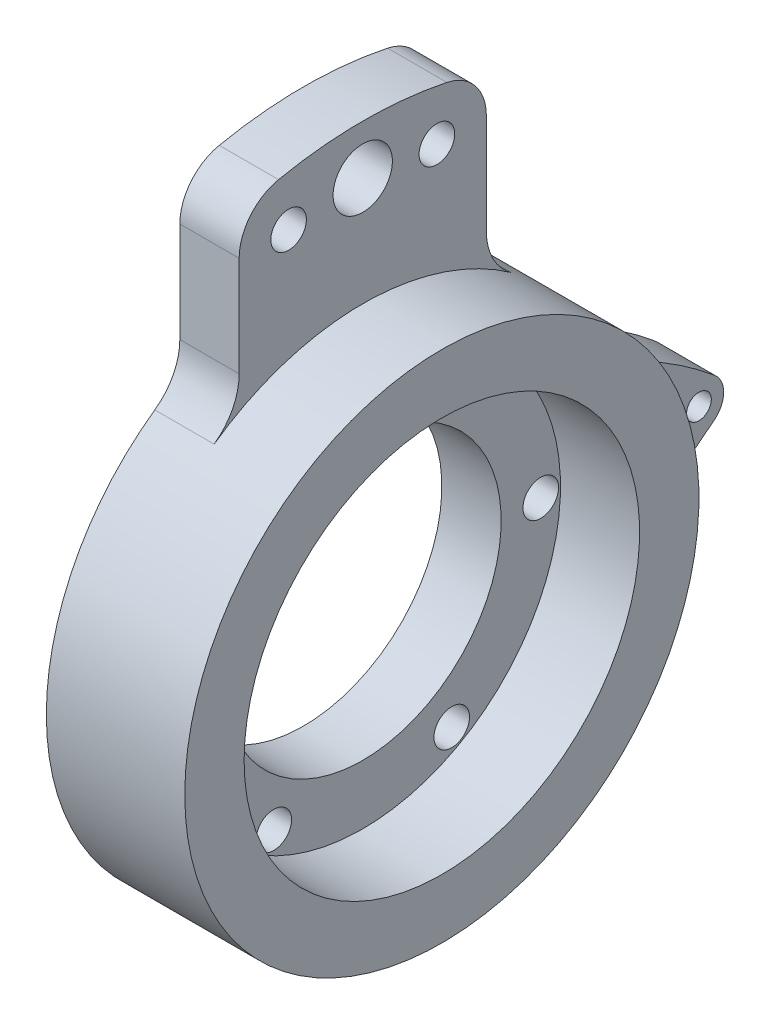
ISO-10303-21;
HEADER;
FILE_DESCRIPTION(('STEP AP214'),'2;1');
FILE_NAME('part.step','',(''),(''),'','','');
FILE_SCHEMA(('AUTOMOTIVE_DESIGN { 1 0 10303 214 1 1 1 1 }'));
ENDSEC;
DATA;
#1=APPLICATION_CONTEXT('core data for automotive mechanical design processes');
#2=APPLICATION_PROTOCOL_DEFINITION('international standard','automotive_design',2000,#1);
#3=PRODUCT_CONTEXT('',#1,'mechanical');
#4=PRODUCT('Part','Part','',(#3));
#5=PRODUCT_RELATED_PRODUCT_CATEGORY('part','',(#4));
#6=PRODUCT_DEFINITION_FORMATION('','',#4);
#7=PRODUCT_DEFINITION_CONTEXT('part definition',#1,'design');
#8=PRODUCT_DEFINITION('design','',#6,#7);
#9=PRODUCT_DEFINITION_SHAPE('','',#8);
#10=(LENGTH_UNIT() NAMED_UNIT(*) SI_UNIT(.MILLI.,.METRE.));
#11=(NAMED_UNIT(*) PLANE_ANGLE_UNIT() SI_UNIT($,.RADIAN.));
#12=(NAMED_UNIT(*) SI_UNIT($,.STERADIAN.) SOLID_ANGLE_UNIT());
#13=UNCERTAINTY_MEASURE_WITH_UNIT(LENGTH_MEASURE(1.E-05),#10,'distance_accuracy_value','');
#14=(GEOMETRIC_REPRESENTATION_CONTEXT(3) GLOBAL_UNCERTAINTY_ASSIGNED_CONTEXT((#13)) GLOBAL_UNIT_ASSIGNED_CONTEXT((#10,
#11,#12)) REPRESENTATION_CONTEXT('',''));
#15=CARTESIAN_POINT('',(0.,0.,0.));
#16=DIRECTION('',(0.,0.,1.));
#17=DIRECTION('',(1.,0.,0.));
#18=AXIS2_PLACEMENT_3D('',#15,#16,#17);
#19=CARTESIAN_POINT('',(0.,26.,0.));
#20=DIRECTION('',(1.,0.,0.));
#21=DIRECTION('',(0.,0.,-1.));
#22=AXIS2_PLACEMENT_3D('',#19,#20,#21);
#23=PLANE('',#22);
#24=CARTESIAN_POINT('',(0.,0.,-34.));
#25=DIRECTION('',(-1.,0.,0.));
#26=DIRECTION('',(0.,0.,1.));
#27=AXIS2_PLACEMENT_3D('',#24,#25,#26);
#28=CIRCLE('',#27,1.25);
#29=CARTESIAN_POINT('',(0.,0.,-32.75));
#30=VERTEX_POINT('',#29);
#31=EDGE_CURVE('E161',#30,#30,#28,.T.);
#32=ORIENTED_EDGE('',*,*,#31,.F.);
#33=EDGE_LOOP('',(#32));
#34=FACE_BOUND('',#33,.T.);
#35=CARTESIAN_POINT('',(0.,0.,0.));
#36=DIRECTION('',(-1.,0.,0.));
#37=DIRECTION('',(0.,0.,1.));
#38=AXIS2_PLACEMENT_3D('',#35,#36,#37);
#39=CIRCLE('',#38,14.);
#40=CARTESIAN_POINT('',(0.,0.,14.));
#41=VERTEX_POINT('',#40);
#42=EDGE_CURVE('E230',#41,#41,#39,.T.);
#43=ORIENTED_EDGE('',*,*,#42,.F.);
#44=EDGE_LOOP('',(#43));
#45=FACE_BOUND('',#44,.T.);
#46=CARTESIAN_POINT('',(0.,0.,0.));
#47=DIRECTION('',(-1.,0.,0.));
#48=DIRECTION('',(0.,0.,1.));
#49=AXIS2_PLACEMENT_3D('',#46,#47,#48);
#50=CIRCLE('',#49,26.);
#51=CARTESIAN_POINT('',(0.,-10.,-24.));
#52=VERTEX_POINT('',#51);
#53=CARTESIAN_POINT('',(0.,21.2146535073637,15.03125));
#54=VERTEX_POINT('',#53);
#55=EDGE_CURVE('E216',#52,#54,#50,.T.);
#56=ORIENTED_EDGE('',*,*,#55,.T.);
#57=CARTESIAN_POINT('',(0.,26.1103427782938,18.5));
#58=DIRECTION('',(1.,0.,0.));
#59=DIRECTION('',(0.,0.,-1.));
#60=AXIS2_PLACEMENT_3D('',#57,#58,#59);
#61=CIRCLE('',#60,6.);
#62=CARTESIAN_POINT('',(0.,26.1103427782938,12.5));
#63=VERTEX_POINT('',#62);
#64=EDGE_CURVE('E47',#54,#63,#61,.T.);
#65=ORIENTED_EDGE('',*,*,#64,.T.);
#66=DIRECTION('',(0.,-1.,0.));
#67=VECTOR('',#66,1.);
#68=CARTESIAN_POINT('',(0.,36.2318920289846,12.5));
#69=LINE('',#68,#67);
#70=CARTESIAN_POINT('',(0.,36.2318920289846,12.5));
#71=VERTEX_POINT('',#70);
#72=EDGE_CURVE('E461',#71,#63,#69,.T.);
#73=ORIENTED_EDGE('',*,*,#72,.F.);
#74=CARTESIAN_POINT('',(0.,36.2318920289846,7.5));
#75=DIRECTION('',(1.,0.,0.));
#76=DIRECTION('',(0.,0.,-1.));
#77=AXIS2_PLACEMENT_3D('',#74,#75,#76);
#78=CIRCLE('',#77,5.00000000000001);
#79=CARTESIAN_POINT('',(0.,41.1280936545231,8.51351351351351));
#80=VERTEX_POINT('',#79);
#81=EDGE_CURVE('E160',#80,#71,#78,.T.);
#82=ORIENTED_EDGE('',*,*,#81,.F.);
#83=CARTESIAN_POINT('',(0.,0.,0.));
#84=DIRECTION('',(1.,0.,0.));
#85=DIRECTION('',(0.,0.,-1.));
#86=AXIS2_PLACEMENT_3D('',#83,#84,#85);
#87=CIRCLE('',#86,42.);
#88=CARTESIAN_POINT('',(0.,41.1280936545231,-8.51351351351351));
#89=VERTEX_POINT('',#88);
#90=EDGE_CURVE('E156',#89,#80,#87,.T.);
#91=ORIENTED_EDGE('',*,*,#90,.F.);
#92=CARTESIAN_POINT('',(0.,36.2318920289846,-7.5));
#93=DIRECTION('',(1.,0.,0.));
#94=DIRECTION('',(0.,0.,-1.));
#95=AXIS2_PLACEMENT_3D('',#92,#93,#94);
#96=CIRCLE('',#95,5.00000000000001);
#97=CARTESIAN_POINT('',(0.,36.2318920289846,-12.5));
#98=VERTEX_POINT('',#97);
#99=EDGE_CURVE('E464',#98,#89,#96,.T.);
#100=ORIENTED_EDGE('',*,*,#99,.F.);
#101=DIRECTION('',(0.,1.,0.));
#102=VECTOR('',#101,1.);
#103=CARTESIAN_POINT('',(0.,36.2318920289846,-12.5));
#104=LINE('',#103,#102);
#105=CARTESIAN_POINT('',(0.,26.1103427782938,-12.5));
#106=VERTEX_POINT('',#105);
#107=EDGE_CURVE('E264',#106,#98,#104,.T.);
#108=ORIENTED_EDGE('',*,*,#107,.F.);
#109=CARTESIAN_POINT('',(0.,26.1103427782938,-18.5));
#110=DIRECTION('',(1.,0.,0.));
#111=DIRECTION('',(0.,0.,-1.));
#112=AXIS2_PLACEMENT_3D('',#109,#110,#111);
#113=CIRCLE('',#112,6.);
#114=CARTESIAN_POINT('',(0.,21.2146535073637,-15.03125));
#115=VERTEX_POINT('',#114);
#116=EDGE_CURVE('E243',#106,#115,#113,.T.);
#117=ORIENTED_EDGE('',*,*,#116,.T.);
#118=CARTESIAN_POINT('',(0.,10.,-24.));
#119=VERTEX_POINT('',#118);
#120=EDGE_CURVE('E215',#115,#119,#50,.T.);
#121=ORIENTED_EDGE('',*,*,#120,.T.);
#122=CARTESIAN_POINT('',(0.,11.5384615384615,-27.6923076923077));
#123=DIRECTION('',(-1.,0.,0.));
#124=DIRECTION('',(0.,0.,1.));
#125=AXIS2_PLACEMENT_3D('',#122,#123,#124);
#126=CIRCLE('',#125,4.);
#127=CARTESIAN_POINT('',(0.,7.88278972648782,-26.0687118056595));
#128=VERTEX_POINT('',#127);
#129=EDGE_CURVE('E179',#128,#119,#126,.T.);
#130=ORIENTED_EDGE('',*,*,#129,.F.);
#131=CARTESIAN_POINT('',(0.,-28.6739283932494,-9.83275293917803));
#132=DIRECTION('',(1.,0.,0.));
#133=DIRECTION('',(0.,0.,-1.));
#134=AXIS2_PLACEMENT_3D('',#131,#132,#133);
#135=CIRCLE('',#134,40.);
#136=CARTESIAN_POINT('',(0.,1.91159522621663,-35.6111498040548));
#137=VERTEX_POINT('',#136);
#138=EDGE_CURVE('E195',#137,#128,#135,.T.);
#139=ORIENTED_EDGE('',*,*,#138,.F.);
#140=CARTESIAN_POINT('',(0.,0.,-34.));
#141=DIRECTION('',(1.,0.,0.));
#142=DIRECTION('',(0.,0.,-1.));
#143=AXIS2_PLACEMENT_3D('',#140,#141,#142);
#144=CIRCLE('',#143,2.50000000000001);
#145=CARTESIAN_POINT('',(0.,-1.91159522621663,-35.6111498040548));
#146=VERTEX_POINT('',#145);
#147=EDGE_CURVE('E193',#146,#137,#144,.T.);
#148=ORIENTED_EDGE('',*,*,#147,.F.);
#149=CARTESIAN_POINT('',(0.,28.6739283932494,-9.83275293917803));
#150=DIRECTION('',(1.,0.,0.));
#151=DIRECTION('',(0.,0.,-1.));
#152=AXIS2_PLACEMENT_3D('',#149,#150,#151);
#153=CIRCLE('',#152,40.);
#154=CARTESIAN_POINT('',(0.,-7.88278972648782,-26.0687118056595));
#155=VERTEX_POINT('',#154);
#156=EDGE_CURVE('E191',#155,#146,#153,.T.);
#157=ORIENTED_EDGE('',*,*,#156,.F.);
#158=CARTESIAN_POINT('',(0.,-11.5384615384615,-27.6923076923077));
#159=DIRECTION('',(-1.,0.,0.));
#160=DIRECTION('',(0.,0.,1.));
#161=AXIS2_PLACEMENT_3D('',#158,#159,#160);
#162=CIRCLE('',#161,4.);
#163=EDGE_CURVE('E174',#52,#155,#162,.T.);
#164=ORIENTED_EDGE('',*,*,#163,.F.);
#165=EDGE_LOOP('',(#56,#65,#73,#82,#91,#100,#108,#117,#121,#130,#139,#148,#157,#164));
#166=FACE_BOUND('',#165,.T.);
#167=CARTESIAN_POINT('',(0.,37.,0.));
#168=DIRECTION('',(1.,0.,0.));
#169=DIRECTION('',(0.,0.,-1.));
#170=AXIS2_PLACEMENT_3D('',#167,#168,#169);
#171=CIRCLE('',#170,3.);
#172=CARTESIAN_POINT('',(0.,37.,-3.));
#173=VERTEX_POINT('',#172);
#174=EDGE_CURVE('E450',#173,#173,#171,.T.);
#175=ORIENTED_EDGE('',*,*,#174,.T.);
#176=EDGE_LOOP('',(#175));
#177=FACE_BOUND('',#176,.T.);
#178=CARTESIAN_POINT('',(0.,0.,18.));
#179=DIRECTION('',(-1.,0.,0.));
#180=DIRECTION('',(0.,0.,1.));
#181=AXIS2_PLACEMENT_3D('',#178,#179,#180);
#182=CIRCLE('',#181,1.8);
#183=CARTESIAN_POINT('',(0.,0.,19.8));
#184=VERTEX_POINT('',#183);
#185=EDGE_CURVE('E444',#184,#184,#182,.T.);
#186=ORIENTED_EDGE('',*,*,#185,.F.);
#187=EDGE_LOOP('',(#186));
#188=FACE_BOUND('',#187,.T.);
#189=CARTESIAN_POINT('',(0.,15.5884572681199,8.99999999999996));
#190=DIRECTION('',(-1.,0.,0.));
#191=DIRECTION('',(0.,0.,1.));
#192=AXIS2_PLACEMENT_3D('',#189,#190,#191);
#193=CIRCLE('',#192,1.8);
#194=CARTESIAN_POINT('',(0.,15.5884572681199,10.8));
#195=VERTEX_POINT('',#194);
#196=EDGE_CURVE('E438',#195,#195,#193,.T.);
#197=ORIENTED_EDGE('',*,*,#196,.F.);
#198=EDGE_LOOP('',(#197));
#199=FACE_BOUND('',#198,.T.);
#200=CARTESIAN_POINT('',(0.,15.5884572681199,-9.00000000000007));
#201=DIRECTION('',(-1.,0.,0.));
#202=DIRECTION('',(0.,0.,1.));
#203=AXIS2_PLACEMENT_3D('',#200,#201,#202);
#204=CIRCLE('',#203,1.8);
#205=CARTESIAN_POINT('',(0.,15.5884572681199,-7.20000000000007));
#206=VERTEX_POINT('',#205);
#207=EDGE_CURVE('E432',#206,#206,#204,.T.);
#208=ORIENTED_EDGE('',*,*,#207,.F.);
#209=EDGE_LOOP('',(#208));
#210=FACE_BOUND('',#209,.T.);
#211=CARTESIAN_POINT('',(0.,0.,-18.));
#212=DIRECTION('',(-1.,0.,0.));
#213=DIRECTION('',(0.,0.,1.));
#214=AXIS2_PLACEMENT_3D('',#211,#212,#213);
#215=CIRCLE('',#214,1.8);
#216=CARTESIAN_POINT('',(0.,0.,-16.2));
#217=VERTEX_POINT('',#216);
#218=EDGE_CURVE('E426',#217,#217,#215,.T.);
#219=ORIENTED_EDGE('',*,*,#218,.F.);
#220=EDGE_LOOP('',(#219));
#221=FACE_BOUND('',#220,.T.);
#222=CARTESIAN_POINT('',(0.,-15.58845726812,-8.99999999999985));
#223=DIRECTION('',(-1.,0.,0.));
#224=DIRECTION('',(0.,0.,1.));
#225=AXIS2_PLACEMENT_3D('',#222,#223,#224);
#226=CIRCLE('',#225,1.8);
#227=CARTESIAN_POINT('',(0.,-15.58845726812,-7.19999999999985));
#228=VERTEX_POINT('',#227);
#229=EDGE_CURVE('E420',#228,#228,#226,.T.);
#230=ORIENTED_EDGE('',*,*,#229,.F.);
#231=EDGE_LOOP('',(#230));
#232=FACE_BOUND('',#231,.T.);
#233=CARTESIAN_POINT('',(0.,-15.5884572681198,9.00000000000018));
#234=DIRECTION('',(-1.,0.,0.));
#235=DIRECTION('',(0.,0.,1.));
#236=AXIS2_PLACEMENT_3D('',#233,#234,#235);
#237=CIRCLE('',#236,1.8);
#238=CARTESIAN_POINT('',(0.,-15.5884572681198,10.8000000000002));
#239=VERTEX_POINT('',#238);
#240=EDGE_CURVE('E414',#239,#239,#237,.T.);
#241=ORIENTED_EDGE('',*,*,#240,.F.);
#242=EDGE_LOOP('',(#241));
#243=FACE_BOUND('',#242,.T.);
#244=CARTESIAN_POINT('',(0.,36.2318920289846,-7.5));
#245=DIRECTION('',(-1.,0.,0.));
#246=DIRECTION('',(0.,0.,1.));
#247=AXIS2_PLACEMENT_3D('',#244,#245,#246);
#248=CIRCLE('',#247,1.8);
#249=CARTESIAN_POINT('',(0.,36.2318920289846,-5.7));
#250=VERTEX_POINT('',#249);
#251=EDGE_CURVE('E405',#250,#250,#248,.T.);
#252=ORIENTED_EDGE('',*,*,#251,.F.);
#253=EDGE_LOOP('',(#252));
#254=FACE_BOUND('',#253,.T.);
#255=CARTESIAN_POINT('',(0.,36.2318920289846,7.5));
#256=DIRECTION('',(-1.,0.,0.));
#257=DIRECTION('',(0.,0.,1.));
#258=AXIS2_PLACEMENT_3D('',#255,#256,#257);
#259=CIRCLE('',#258,1.8);
#260=CARTESIAN_POINT('',(0.,36.2318920289846,9.3));
#261=VERTEX_POINT('',#260);
#262=EDGE_CURVE('E401',#261,#261,#259,.T.);
#263=ORIENTED_EDGE('',*,*,#262,.F.);
#264=EDGE_LOOP('',(#263));
#265=FACE_BOUND('',#264,.T.);
#266=ADVANCED_FACE('F39',(#34,#45,#166,#177,#188,#199,#210,#221,#232,#243,#254,#265),#23,.F.);
#267=CARTESIAN_POINT('',(-2.25720811826591,0.,0.));
#268=DIRECTION('',(-1.,0.,0.));
#269=DIRECTION('',(0.,0.,1.));
#270=AXIS2_PLACEMENT_3D('',#267,#268,#269);
#271=CYLINDRICAL_SURFACE('',#270,26.);
#272=CARTESIAN_POINT('',(14.0000000000001,0.,0.));
#273=DIRECTION('',(-1.,0.,0.));
#274=DIRECTION('',(0.,0.,1.));
#275=AXIS2_PLACEMENT_3D('',#272,#273,#274);
#276=CIRCLE('',#275,26.);
#277=CARTESIAN_POINT('',(14.0000000000001,0.,26.));
#278=VERTEX_POINT('',#277);
#279=EDGE_CURVE('E218',#278,#278,#276,.T.);
#280=ORIENTED_EDGE('',*,*,#279,.T.);
#281=EDGE_LOOP('',(#280));
#282=FACE_BOUND('',#281,.T.);
#283=ORIENTED_EDGE('',*,*,#120,.F.);
#284=DIRECTION('',(-1.,0.,0.));
#285=VECTOR('',#284,1.);
#286=CARTESIAN_POINT('',(-2.25720811826591,21.2146535073637,-15.03125));
#287=LINE('',#286,#285);
#288=CARTESIAN_POINT('',(6.00000000000001,21.2146535073637,-15.03125));
#289=VERTEX_POINT('',#288);
#290=EDGE_CURVE('E239',#115,#289,#287,.F.);
#291=ORIENTED_EDGE('',*,*,#290,.T.);
#292=CARTESIAN_POINT('',(6.00000000000001,0.,0.));
#293=DIRECTION('',(-1.,0.,0.));
#294=DIRECTION('',(0.,0.,-1.));
#295=AXIS2_PLACEMENT_3D('',#292,#293,#294);
#296=CIRCLE('',#295,26.);
#297=CARTESIAN_POINT('',(6.00000000000001,21.2146535073637,15.03125));
#298=VERTEX_POINT('',#297);
#299=EDGE_CURVE('E145',#298,#289,#296,.T.);
#300=ORIENTED_EDGE('',*,*,#299,.F.);
#301=DIRECTION('',(-1.,0.,0.));
#302=VECTOR('',#301,1.);
#303=CARTESIAN_POINT('',(-2.25720811826591,21.2146535073637,15.03125));
#304=LINE('',#303,#302);
#305=EDGE_CURVE('E236',#298,#54,#304,.T.);
#306=ORIENTED_EDGE('',*,*,#305,.T.);
#307=ORIENTED_EDGE('',*,*,#55,.F.);
#308=DIRECTION('',(-1.,0.,0.));
#309=VECTOR('',#308,1.);
#310=CARTESIAN_POINT('',(6.00000000000001,-10.,-24.));
#311=LINE('',#310,#309);
#312=CARTESIAN_POINT('',(6.00000000000001,-10.,-24.));
#313=VERTEX_POINT('',#312);
#314=EDGE_CURVE('E213',#313,#52,#311,.T.);
#315=ORIENTED_EDGE('',*,*,#314,.F.);
#316=CARTESIAN_POINT('',(6.00000000000001,0.,0.));
#317=DIRECTION('',(-1.,0.,0.));
#318=DIRECTION('',(0.,0.,1.));
#319=AXIS2_PLACEMENT_3D('',#316,#317,#318);
#320=CIRCLE('',#319,26.);
#321=CARTESIAN_POINT('',(6.00000000000001,10.,-24.));
#322=VERTEX_POINT('',#321);
#323=EDGE_CURVE('E175',#322,#313,#320,.T.);
#324=ORIENTED_EDGE('',*,*,#323,.F.);
#325=DIRECTION('',(-1.,0.,0.));
#326=VECTOR('',#325,1.);
#327=CARTESIAN_POINT('',(6.00000000000001,10.,-24.));
#328=LINE('',#327,#326);
#329=EDGE_CURVE('E189',#322,#119,#328,.T.);
#330=ORIENTED_EDGE('',*,*,#329,.T.);
#331=EDGE_LOOP('',(#283,#291,#300,#306,#307,#315,#324,#330));
#332=FACE_BOUND('',#331,.T.);
#333=ADVANCED_FACE('F266',(#282,#332),#271,.T.);
#334=CARTESIAN_POINT('',(-2.25720811826591,0.,0.));
#335=DIRECTION('',(-1.,0.,0.));
#336=DIRECTION('',(0.,0.,1.));
#337=AXIS2_PLACEMENT_3D('',#334,#335,#336);
#338=CYLINDRICAL_SURFACE('',#337,14.);
#339=CARTESIAN_POINT('',(6.00000000000001,0.,0.));
#340=DIRECTION('',(-1.,0.,0.));
#341=DIRECTION('',(0.,0.,1.));
#342=AXIS2_PLACEMENT_3D('',#339,#340,#341);
#343=CIRCLE('',#342,14.);
#344=CARTESIAN_POINT('',(6.00000000000001,0.,14.));
#345=VERTEX_POINT('',#344);
#346=EDGE_CURVE('E227',#345,#345,#343,.T.);
#347=ORIENTED_EDGE('',*,*,#346,.F.);
#348=EDGE_LOOP('',(#347));
#349=FACE_BOUND('',#348,.T.);
#350=ORIENTED_EDGE('',*,*,#42,.T.);
#351=EDGE_LOOP('',(#350));
#352=FACE_BOUND('',#351,.T.);
#353=ADVANCED_FACE('F310',(#349,#352),#338,.F.);
#354=CARTESIAN_POINT('',(6.00000000000001,14.,0.));
#355=DIRECTION('',(-1.,0.,0.));
#356=DIRECTION('',(0.,0.,1.));
#357=AXIS2_PLACEMENT_3D('',#354,#355,#356);
#358=PLANE('',#357);
#359=CARTESIAN_POINT('',(6.00000000000001,-15.5884572681198,9.00000000000018));
#360=DIRECTION('',(-1.,0.,0.));
#361=DIRECTION('',(0.,0.,1.));
#362=AXIS2_PLACEMENT_3D('',#359,#360,#361);
#363=CIRCLE('',#362,1.8);
#364=CARTESIAN_POINT('',(6.00000000000001,-15.5884572681198,10.8000000000002));
#365=VERTEX_POINT('',#364);
#366=EDGE_CURVE('E417',#365,#365,#363,.T.);
#367=ORIENTED_EDGE('',*,*,#366,.T.);
#368=EDGE_LOOP('',(#367));
#369=FACE_BOUND('',#368,.T.);
#370=CARTESIAN_POINT('',(6.00000000000001,-15.58845726812,-8.99999999999985));
#371=DIRECTION('',(-1.,0.,0.));
#372=DIRECTION('',(0.,0.,1.));
#373=AXIS2_PLACEMENT_3D('',#370,#371,#372);
#374=CIRCLE('',#373,1.8);
#375=CARTESIAN_POINT('',(6.00000000000001,-15.58845726812,-7.19999999999985));
#376=VERTEX_POINT('',#375);
#377=EDGE_CURVE('E423',#376,#376,#374,.T.);
#378=ORIENTED_EDGE('',*,*,#377,.T.);
#379=EDGE_LOOP('',(#378));
#380=FACE_BOUND('',#379,.T.);
#381=CARTESIAN_POINT('',(6.00000000000001,0.,-18.));
#382=DIRECTION('',(-1.,0.,0.));
#383=DIRECTION('',(0.,0.,1.));
#384=AXIS2_PLACEMENT_3D('',#381,#382,#383);
#385=CIRCLE('',#384,1.8);
#386=CARTESIAN_POINT('',(6.00000000000001,0.,-16.2));
#387=VERTEX_POINT('',#386);
#388=EDGE_CURVE('E429',#387,#387,#385,.T.);
#389=ORIENTED_EDGE('',*,*,#388,.T.);
#390=EDGE_LOOP('',(#389));
#391=FACE_BOUND('',#390,.T.);
#392=CARTESIAN_POINT('',(6.00000000000001,15.5884572681199,-9.00000000000007));
#393=DIRECTION('',(-1.,0.,0.));
#394=DIRECTION('',(0.,0.,1.));
#395=AXIS2_PLACEMENT_3D('',#392,#393,#394);
#396=CIRCLE('',#395,1.8);
#397=CARTESIAN_POINT('',(6.00000000000001,15.5884572681199,-7.20000000000007));
#398=VERTEX_POINT('',#397);
#399=EDGE_CURVE('E435',#398,#398,#396,.T.);
#400=ORIENTED_EDGE('',*,*,#399,.T.);
#401=EDGE_LOOP('',(#400));
#402=FACE_BOUND('',#401,.T.);
#403=CARTESIAN_POINT('',(6.00000000000001,15.5884572681199,8.99999999999996));
#404=DIRECTION('',(-1.,0.,0.));
#405=DIRECTION('',(0.,0.,1.));
#406=AXIS2_PLACEMENT_3D('',#403,#404,#405);
#407=CIRCLE('',#406,1.8);
#408=CARTESIAN_POINT('',(6.00000000000001,15.5884572681199,10.8));
#409=VERTEX_POINT('',#408);
#410=EDGE_CURVE('E441',#409,#409,#407,.T.);
#411=ORIENTED_EDGE('',*,*,#410,.T.);
#412=EDGE_LOOP('',(#411));
#413=FACE_BOUND('',#412,.T.);
#414=CARTESIAN_POINT('',(6.00000000000001,0.,18.));
#415=DIRECTION('',(-1.,0.,0.));
#416=DIRECTION('',(0.,0.,1.));
#417=AXIS2_PLACEMENT_3D('',#414,#415,#416);
#418=CIRCLE('',#417,1.8);
#419=CARTESIAN_POINT('',(6.00000000000001,0.,19.8));
#420=VERTEX_POINT('',#419);
#421=EDGE_CURVE('E447',#420,#420,#418,.T.);
#422=ORIENTED_EDGE('',*,*,#421,.T.);
#423=EDGE_LOOP('',(#422));
#424=FACE_BOUND('',#423,.T.);
#425=CARTESIAN_POINT('',(6.00000000000001,0.,0.));
#426=DIRECTION('',(-1.,0.,0.));
#427=DIRECTION('',(0.,0.,1.));
#428=AXIS2_PLACEMENT_3D('',#425,#426,#427);
#429=CIRCLE('',#428,20.);
#430=CARTESIAN_POINT('',(6.00000000000001,0.,20.));
#431=VERTEX_POINT('',#430);
#432=EDGE_CURVE('E224',#431,#431,#429,.T.);
#433=ORIENTED_EDGE('',*,*,#432,.F.);
#434=EDGE_LOOP('',(#433));
#435=FACE_BOUND('',#434,.T.);
#436=ORIENTED_EDGE('',*,*,#346,.T.);
#437=EDGE_LOOP('',(#436));
#438=FACE_BOUND('',#437,.T.);
#439=ADVANCED_FACE('F318',(#369,#380,#391,#402,#413,#424,#435,#438),#358,.F.);
#440=CARTESIAN_POINT('',(-2.25720811826591,0.,0.));
#441=DIRECTION('',(-1.,0.,0.));
#442=DIRECTION('',(0.,0.,1.));
#443=AXIS2_PLACEMENT_3D('',#440,#441,#442);
#444=CYLINDRICAL_SURFACE('',#443,20.);
#445=CARTESIAN_POINT('',(14.0000000000001,0.,0.));
#446=DIRECTION('',(-1.,0.,0.));
#447=DIRECTION('',(0.,0.,1.));
#448=AXIS2_PLACEMENT_3D('',#445,#446,#447);
#449=CIRCLE('',#448,20.);
#450=CARTESIAN_POINT('',(14.0000000000001,0.,20.));
#451=VERTEX_POINT('',#450);
#452=EDGE_CURVE('E221',#451,#451,#449,.T.);
#453=ORIENTED_EDGE('',*,*,#452,.F.);
#454=EDGE_LOOP('',(#453));
#455=FACE_BOUND('',#454,.T.);
#456=ORIENTED_EDGE('',*,*,#432,.T.);
#457=EDGE_LOOP('',(#456));
#458=FACE_BOUND('',#457,.T.);
#459=ADVANCED_FACE('F322',(#455,#458),#444,.F.);
#460=CARTESIAN_POINT('',(14.0000000000001,20.,0.));
#461=DIRECTION('',(-1.,0.,0.));
#462=DIRECTION('',(0.,0.,1.));
#463=AXIS2_PLACEMENT_3D('',#460,#461,#462);
#464=PLANE('',#463);
#465=ORIENTED_EDGE('',*,*,#279,.F.);
#466=EDGE_LOOP('',(#465));
#467=FACE_BOUND('',#466,.T.);
#468=ORIENTED_EDGE('',*,*,#452,.T.);
#469=EDGE_LOOP('',(#468));
#470=FACE_BOUND('',#469,.T.);
#471=ADVANCED_FACE('F326',(#467,#470),#464,.F.);
#472=CARTESIAN_POINT('',(6.00000000000001,-11.5384615384615,-27.6923076923077));
#473=DIRECTION('',(-1.,0.,0.));
#474=DIRECTION('',(0.,0.,1.));
#475=AXIS2_PLACEMENT_3D('',#472,#473,#474);
#476=CYLINDRICAL_SURFACE('',#475,4.);
#477=ORIENTED_EDGE('',*,*,#163,.T.);
#478=DIRECTION('',(-1.,0.,0.));
#479=VECTOR('',#478,1.);
#480=CARTESIAN_POINT('',(6.00000000000001,-7.88278972648782,-26.0687118056595));
#481=LINE('',#480,#479);
#482=CARTESIAN_POINT('',(6.00000000000001,-7.88278972648782,-26.0687118056595));
#483=VERTEX_POINT('',#482);
#484=EDGE_CURVE('E210',#483,#155,#481,.T.);
#485=ORIENTED_EDGE('',*,*,#484,.F.);
#486=CARTESIAN_POINT('',(6.00000000000001,-11.5384615384615,-27.6923076923077));
#487=DIRECTION('',(-1.,0.,0.));
#488=DIRECTION('',(0.,0.,1.));
#489=AXIS2_PLACEMENT_3D('',#486,#487,#488);
#490=CIRCLE('',#489,4.);
#491=EDGE_CURVE('E178',#313,#483,#490,.T.);
#492=ORIENTED_EDGE('',*,*,#491,.F.);
#493=ORIENTED_EDGE('',*,*,#314,.T.);
#494=EDGE_LOOP('',(#477,#485,#492,#493));
#495=FACE_BOUND('',#494,.T.);
#496=ADVANCED_FACE('F329',(#495),#476,.F.);
#497=CARTESIAN_POINT('',(6.00000000000001,28.6739283932494,-9.83275293917803));
#498=DIRECTION('',(-1.,0.,0.));
#499=DIRECTION('',(0.,0.,1.));
#500=AXIS2_PLACEMENT_3D('',#497,#498,#499);
#501=CYLINDRICAL_SURFACE('',#500,40.);
#502=ORIENTED_EDGE('',*,*,#156,.T.);
#503=DIRECTION('',(-1.,0.,0.));
#504=VECTOR('',#503,1.);
#505=CARTESIAN_POINT('',(6.00000000000001,-1.91159522621663,-35.6111498040548));
#506=LINE('',#505,#504);
#507=CARTESIAN_POINT('',(6.00000000000001,-1.91159522621663,-35.6111498040548));
#508=VERTEX_POINT('',#507);
#509=EDGE_CURVE('E207',#508,#146,#506,.T.);
#510=ORIENTED_EDGE('',*,*,#509,.F.);
#511=CARTESIAN_POINT('',(6.00000000000001,28.6739283932494,-9.83275293917803));
#512=DIRECTION('',(1.,0.,0.));
#513=DIRECTION('',(0.,0.,-1.));
#514=AXIS2_PLACEMENT_3D('',#511,#512,#513);
#515=CIRCLE('',#514,40.);
#516=EDGE_CURVE('E181',#483,#508,#515,.T.);
#517=ORIENTED_EDGE('',*,*,#516,.F.);
#518=ORIENTED_EDGE('',*,*,#484,.T.);
#519=EDGE_LOOP('',(#502,#510,#517,#518));
#520=FACE_BOUND('',#519,.T.);
#521=ADVANCED_FACE('F287',(#520),#501,.T.);
#522=CARTESIAN_POINT('',(6.00000000000001,0.,-34.));
#523=DIRECTION('',(-1.,0.,0.));
#524=DIRECTION('',(0.,0.,1.));
#525=AXIS2_PLACEMENT_3D('',#522,#523,#524);
#526=CYLINDRICAL_SURFACE('',#525,2.50000000000001);
#527=ORIENTED_EDGE('',*,*,#147,.T.);
#528=DIRECTION('',(-1.,0.,0.));
#529=VECTOR('',#528,1.);
#530=CARTESIAN_POINT('',(6.00000000000001,1.91159522621663,-35.6111498040548));
#531=LINE('',#530,#529);
#532=CARTESIAN_POINT('',(6.00000000000001,1.91159522621663,-35.6111498040548));
#533=VERTEX_POINT('',#532);
#534=EDGE_CURVE('E204',#533,#137,#531,.T.);
#535=ORIENTED_EDGE('',*,*,#534,.F.);
#536=CARTESIAN_POINT('',(6.00000000000001,0.,-34.));
#537=DIRECTION('',(1.,0.,0.));
#538=DIRECTION('',(0.,0.,-1.));
#539=AXIS2_PLACEMENT_3D('',#536,#537,#538);
#540=CIRCLE('',#539,2.50000000000001);
#541=EDGE_CURVE('E183',#508,#533,#540,.T.);
#542=ORIENTED_EDGE('',*,*,#541,.F.);
#543=ORIENTED_EDGE('',*,*,#509,.T.);
#544=EDGE_LOOP('',(#527,#535,#542,#543));
#545=FACE_BOUND('',#544,.T.);
#546=ADVANCED_FACE('F283',(#545),#526,.T.);
#547=CARTESIAN_POINT('',(6.00000000000001,-28.6739283932494,-9.83275293917803));
#548=DIRECTION('',(-1.,0.,0.));
#549=DIRECTION('',(0.,0.,1.));
#550=AXIS2_PLACEMENT_3D('',#547,#548,#549);
#551=CYLINDRICAL_SURFACE('',#550,40.);
#552=ORIENTED_EDGE('',*,*,#138,.T.);
#553=DIRECTION('',(-1.,0.,0.));
#554=VECTOR('',#553,1.);
#555=CARTESIAN_POINT('',(6.00000000000001,7.88278972648782,-26.0687118056595));
#556=LINE('',#555,#554);
#557=CARTESIAN_POINT('',(6.00000000000001,7.88278972648782,-26.0687118056595));
#558=VERTEX_POINT('',#557);
#559=EDGE_CURVE('E201',#558,#128,#556,.T.);
#560=ORIENTED_EDGE('',*,*,#559,.F.);
#561=CARTESIAN_POINT('',(6.00000000000001,-28.6739283932494,-9.83275293917803));
#562=DIRECTION('',(1.,0.,0.));
#563=DIRECTION('',(0.,0.,-1.));
#564=AXIS2_PLACEMENT_3D('',#561,#562,#563);
#565=CIRCLE('',#564,40.);
#566=EDGE_CURVE('E185',#533,#558,#565,.T.);
#567=ORIENTED_EDGE('',*,*,#566,.F.);
#568=ORIENTED_EDGE('',*,*,#534,.T.);
#569=EDGE_LOOP('',(#552,#560,#567,#568));
#570=FACE_BOUND('',#569,.T.);
#571=ADVANCED_FACE('F278',(#570),#551,.T.);
#572=CARTESIAN_POINT('',(6.00000000000001,11.5384615384615,-27.6923076923077));
#573=DIRECTION('',(-1.,0.,0.));
#574=DIRECTION('',(0.,0.,1.));
#575=AXIS2_PLACEMENT_3D('',#572,#573,#574);
#576=CYLINDRICAL_SURFACE('',#575,4.);
#577=ORIENTED_EDGE('',*,*,#129,.T.);
#578=ORIENTED_EDGE('',*,*,#329,.F.);
#579=CARTESIAN_POINT('',(6.00000000000001,11.5384615384615,-27.6923076923077));
#580=DIRECTION('',(-1.,0.,0.));
#581=DIRECTION('',(0.,0.,1.));
#582=AXIS2_PLACEMENT_3D('',#579,#580,#581);
#583=CIRCLE('',#582,4.);
#584=EDGE_CURVE('E187',#558,#322,#583,.T.);
#585=ORIENTED_EDGE('',*,*,#584,.F.);
#586=ORIENTED_EDGE('',*,*,#559,.T.);
#587=EDGE_LOOP('',(#577,#578,#585,#586));
#588=FACE_BOUND('',#587,.T.);
#589=ADVANCED_FACE('F272',(#588),#576,.F.);
#590=CARTESIAN_POINT('',(6.00000000000001,-5.76923076923077,-13.8461538461538));
#591=DIRECTION('',(-1.,0.,0.));
#592=DIRECTION('',(0.,0.,1.));
#593=AXIS2_PLACEMENT_3D('',#590,#591,#592);
#594=PLANE('',#593);
#595=CARTESIAN_POINT('',(6.00000000000001,0.,-34.));
#596=DIRECTION('',(-1.,0.,0.));
#597=DIRECTION('',(0.,0.,1.));
#598=AXIS2_PLACEMENT_3D('',#595,#596,#597);
#599=CIRCLE('',#598,1.25);
#600=CARTESIAN_POINT('',(6.00000000000001,0.,-32.75));
#601=VERTEX_POINT('',#600);
#602=EDGE_CURVE('E165',#601,#601,#599,.T.);
#603=ORIENTED_EDGE('',*,*,#602,.T.);
#604=EDGE_LOOP('',(#603));
#605=FACE_BOUND('',#604,.T.);
#606=ORIENTED_EDGE('',*,*,#323,.T.);
#607=ORIENTED_EDGE('',*,*,#491,.T.);
#608=ORIENTED_EDGE('',*,*,#516,.T.);
#609=ORIENTED_EDGE('',*,*,#541,.T.);
#610=ORIENTED_EDGE('',*,*,#566,.T.);
#611=ORIENTED_EDGE('',*,*,#584,.T.);
#612=EDGE_LOOP('',(#606,#607,#608,#609,#610,#611));
#613=FACE_BOUND('',#612,.T.);
#614=ADVANCED_FACE('F342',(#605,#613),#594,.F.);
#615=CARTESIAN_POINT('',(0.,0.,-34.));
#616=DIRECTION('',(-1.,0.,0.));
#617=DIRECTION('',(0.,0.,1.));
#618=AXIS2_PLACEMENT_3D('',#615,#616,#617);
#619=CYLINDRICAL_SURFACE('',#618,1.25);
#620=ORIENTED_EDGE('',*,*,#602,.F.);
#621=EDGE_LOOP('',(#620));
#622=FACE_BOUND('',#621,.T.);
#623=ORIENTED_EDGE('',*,*,#31,.T.);
#624=EDGE_LOOP('',(#623));
#625=FACE_BOUND('',#624,.T.);
#626=ADVANCED_FACE('F345',(#622,#625),#619,.F.);
#627=CARTESIAN_POINT('',(6.00000000000001,36.2318920289846,7.5));
#628=DIRECTION('',(1.,0.,0.));
#629=DIRECTION('',(0.,0.,-1.));
#630=AXIS2_PLACEMENT_3D('',#627,#628,#629);
#631=PLANE('',#630);
#632=CARTESIAN_POINT('',(6.00000000000001,36.2318920289846,7.5));
#633=DIRECTION('',(1.,0.,0.));
#634=DIRECTION('',(0.,0.,-1.));
#635=AXIS2_PLACEMENT_3D('',#632,#633,#634);
#636=CIRCLE('',#635,1.8);
#637=CARTESIAN_POINT('',(6.00000000000001,36.2318920289846,5.7));
#638=VERTEX_POINT('',#637);
#639=EDGE_CURVE('E404',#638,#638,#636,.T.);
#640=ORIENTED_EDGE('',*,*,#639,.F.);
#641=EDGE_LOOP('',(#640));
#642=FACE_BOUND('',#641,.T.);
#643=CARTESIAN_POINT('',(6.00000000000001,36.2318920289846,-7.5));
#644=DIRECTION('',(1.,0.,0.));
#645=DIRECTION('',(0.,0.,-1.));
#646=AXIS2_PLACEMENT_3D('',#643,#644,#645);
#647=CIRCLE('',#646,1.8);
#648=CARTESIAN_POINT('',(6.00000000000001,36.2318920289846,-9.3));
#649=VERTEX_POINT('',#648);
#650=EDGE_CURVE('E408',#649,#649,#647,.T.);
#651=ORIENTED_EDGE('',*,*,#650,.F.);
#652=EDGE_LOOP('',(#651));
#653=FACE_BOUND('',#652,.T.);
#654=CARTESIAN_POINT('',(6.00000000000001,36.2318920289846,7.5));
#655=DIRECTION('',(1.,0.,0.));
#656=DIRECTION('',(0.,0.,-1.));
#657=AXIS2_PLACEMENT_3D('',#654,#655,#656);
#658=CIRCLE('',#657,5.00000000000001);
#659=CARTESIAN_POINT('',(6.00000000000001,41.1280936545231,8.51351351351351));
#660=VERTEX_POINT('',#659);
#661=CARTESIAN_POINT('',(6.00000000000001,36.2318920289846,12.5));
#662=VERTEX_POINT('',#661);
#663=EDGE_CURVE('E146',#660,#662,#658,.T.);
#664=ORIENTED_EDGE('',*,*,#663,.T.);
#665=DIRECTION('',(0.,-1.,0.));
#666=VECTOR('',#665,1.);
#667=CARTESIAN_POINT('',(6.00000000000001,36.2318920289846,12.5));
#668=LINE('',#667,#666);
#669=CARTESIAN_POINT('',(6.00000000000001,26.1103427782938,12.5));
#670=VERTEX_POINT('',#669);
#671=EDGE_CURVE('E137',#662,#670,#668,.T.);
#672=ORIENTED_EDGE('',*,*,#671,.T.);
#673=CARTESIAN_POINT('',(6.00000000000001,26.1103427782938,18.5));
#674=DIRECTION('',(1.,0.,0.));
#675=DIRECTION('',(0.,0.,-1.));
#676=AXIS2_PLACEMENT_3D('',#673,#674,#675);
#677=CIRCLE('',#676,6.);
#678=EDGE_CURVE('E11',#670,#298,#677,.F.);
#679=ORIENTED_EDGE('',*,*,#678,.T.);
#680=ORIENTED_EDGE('',*,*,#299,.T.);
#681=CARTESIAN_POINT('',(6.00000000000001,26.1103427782938,-18.5));
#682=DIRECTION('',(1.,0.,0.));
#683=DIRECTION('',(0.,0.,-1.));
#684=AXIS2_PLACEMENT_3D('',#681,#682,#683);
#685=CIRCLE('',#684,6.);
#686=CARTESIAN_POINT('',(6.00000000000001,26.1103427782938,-12.5));
#687=VERTEX_POINT('',#686);
#688=EDGE_CURVE('E245',#289,#687,#685,.F.);
#689=ORIENTED_EDGE('',*,*,#688,.T.);
#690=DIRECTION('',(0.,1.,0.));
#691=VECTOR('',#690,1.);
#692=CARTESIAN_POINT('',(6.00000000000001,36.2318920289846,-12.5));
#693=LINE('',#692,#691);
#694=CARTESIAN_POINT('',(6.00000000000001,36.2318920289846,-12.5));
#695=VERTEX_POINT('',#694);
#696=EDGE_CURVE('E248',#687,#695,#693,.T.);
#697=ORIENTED_EDGE('',*,*,#696,.T.);
#698=CARTESIAN_POINT('',(6.00000000000001,36.2318920289846,-7.5));
#699=DIRECTION('',(1.,0.,0.));
#700=DIRECTION('',(0.,0.,-1.));
#701=AXIS2_PLACEMENT_3D('',#698,#699,#700);
#702=CIRCLE('',#701,5.00000000000001);
#703=CARTESIAN_POINT('',(6.00000000000001,41.1280936545231,-8.51351351351351));
#704=VERTEX_POINT('',#703);
#705=EDGE_CURVE('E257',#695,#704,#702,.T.);
#706=ORIENTED_EDGE('',*,*,#705,.T.);
#707=CARTESIAN_POINT('',(6.00000000000001,0.,0.));
#708=DIRECTION('',(1.,0.,0.));
#709=DIRECTION('',(0.,0.,-1.));
#710=AXIS2_PLACEMENT_3D('',#707,#708,#709);
#711=CIRCLE('',#710,42.);
#712=EDGE_CURVE('E152',#704,#660,#711,.T.);
#713=ORIENTED_EDGE('',*,*,#712,.T.);
#714=EDGE_LOOP('',(#664,#672,#679,#680,#689,#697,#706,#713));
#715=FACE_BOUND('',#714,.T.);
#716=CARTESIAN_POINT('',(6.00000000000001,37.,0.));
#717=DIRECTION('',(1.,0.,0.));
#718=DIRECTION('',(0.,0.,-1.));
#719=AXIS2_PLACEMENT_3D('',#716,#717,#718);
#720=CIRCLE('',#719,3.);
#721=CARTESIAN_POINT('',(6.00000000000001,37.,-3.));
#722=VERTEX_POINT('',#721);
#723=EDGE_CURVE('E451',#722,#722,#720,.T.);
#724=ORIENTED_EDGE('',*,*,#723,.F.);
#725=EDGE_LOOP('',(#724));
#726=FACE_BOUND('',#725,.T.);
#727=ADVANCED_FACE('F149',(#642,#653,#715,#726),#631,.T.);
#728=CARTESIAN_POINT('',(6.00000000000001,36.2318920289846,7.5));
#729=DIRECTION('',(-1.,0.,0.));
#730=DIRECTION('',(0.,0.,1.));
#731=AXIS2_PLACEMENT_3D('',#728,#729,#730);
#732=CYLINDRICAL_SURFACE('',#731,5.00000000000001);
#733=ORIENTED_EDGE('',*,*,#81,.T.);
#734=DIRECTION('',(-1.,0.,0.));
#735=VECTOR('',#734,1.);
#736=CARTESIAN_POINT('',(6.00000000000001,36.2318920289846,12.5));
#737=LINE('',#736,#735);
#738=EDGE_CURVE('E141',#662,#71,#737,.T.);
#739=ORIENTED_EDGE('',*,*,#738,.F.);
#740=ORIENTED_EDGE('',*,*,#663,.F.);
#741=DIRECTION('',(-1.,0.,0.));
#742=VECTOR('',#741,1.);
#743=CARTESIAN_POINT('',(6.00000000000001,41.1280936545231,8.51351351351351));
#744=LINE('',#743,#742);
#745=EDGE_CURVE('E459',#660,#80,#744,.T.);
#746=ORIENTED_EDGE('',*,*,#745,.T.);
#747=EDGE_LOOP('',(#733,#739,#740,#746));
#748=FACE_BOUND('',#747,.T.);
#749=ADVANCED_FACE('F158',(#748),#732,.T.);
#750=CARTESIAN_POINT('',(6.00000000000001,36.2318920289846,12.5));
#751=DIRECTION('',(0.,0.,-1.));
#752=DIRECTION('',(0.,1.,0.));
#753=AXIS2_PLACEMENT_3D('',#750,#751,#752);
#754=PLANE('',#753);
#755=ORIENTED_EDGE('',*,*,#72,.T.);
#756=DIRECTION('',(1.,0.,0.));
#757=VECTOR('',#756,1.);
#758=CARTESIAN_POINT('',(6.00000000000001,26.1103427782938,12.5));
#759=LINE('',#758,#757);
#760=EDGE_CURVE('E54',#63,#670,#759,.T.);
#761=ORIENTED_EDGE('',*,*,#760,.T.);
#762=ORIENTED_EDGE('',*,*,#671,.F.);
#763=ORIENTED_EDGE('',*,*,#738,.T.);
#764=EDGE_LOOP('',(#755,#761,#762,#763));
#765=FACE_BOUND('',#764,.T.);
#766=ADVANCED_FACE('F139',(#765),#754,.F.);
#767=CARTESIAN_POINT('',(6.00000000000001,36.2318920289846,-12.5));
#768=DIRECTION('',(0.,0.,1.));
#769=DIRECTION('',(0.,-1.,0.));
#770=AXIS2_PLACEMENT_3D('',#767,#768,#769);
#771=PLANE('',#770);
#772=ORIENTED_EDGE('',*,*,#696,.F.);
#773=DIRECTION('',(1.,0.,0.));
#774=VECTOR('',#773,1.);
#775=CARTESIAN_POINT('',(0.,26.1103427782938,-12.5));
#776=LINE('',#775,#774);
#777=EDGE_CURVE('E233',#687,#106,#776,.F.);
#778=ORIENTED_EDGE('',*,*,#777,.T.);
#779=ORIENTED_EDGE('',*,*,#107,.T.);
#780=DIRECTION('',(-1.,0.,0.));
#781=VECTOR('',#780,1.);
#782=CARTESIAN_POINT('',(6.00000000000001,36.2318920289846,-12.5));
#783=LINE('',#782,#781);
#784=EDGE_CURVE('E162',#695,#98,#783,.T.);
#785=ORIENTED_EDGE('',*,*,#784,.F.);
#786=EDGE_LOOP('',(#772,#778,#779,#785));
#787=FACE_BOUND('',#786,.T.);
#788=ADVANCED_FACE('F254',(#787),#771,.F.);
#789=CARTESIAN_POINT('',(6.00000000000001,36.2318920289846,-7.5));
#790=DIRECTION('',(-1.,0.,0.));
#791=DIRECTION('',(0.,0.,1.));
#792=AXIS2_PLACEMENT_3D('',#789,#790,#791);
#793=CYLINDRICAL_SURFACE('',#792,5.00000000000001);
#794=ORIENTED_EDGE('',*,*,#99,.T.);
#795=DIRECTION('',(-1.,0.,0.));
#796=VECTOR('',#795,1.);
#797=CARTESIAN_POINT('',(6.00000000000001,41.1280936545231,-8.51351351351351));
#798=LINE('',#797,#796);
#799=EDGE_CURVE('E168',#704,#89,#798,.T.);
#800=ORIENTED_EDGE('',*,*,#799,.F.);
#801=ORIENTED_EDGE('',*,*,#705,.F.);
#802=ORIENTED_EDGE('',*,*,#784,.T.);
#803=EDGE_LOOP('',(#794,#800,#801,#802));
#804=FACE_BOUND('',#803,.T.);
#805=ADVANCED_FACE('F356',(#804),#793,.T.);
#806=CARTESIAN_POINT('',(6.00000000000001,0.,0.));
#807=DIRECTION('',(-1.,0.,0.));
#808=DIRECTION('',(0.,0.,1.));
#809=AXIS2_PLACEMENT_3D('',#806,#807,#808);
#810=CYLINDRICAL_SURFACE('',#809,42.);
#811=ORIENTED_EDGE('',*,*,#90,.T.);
#812=ORIENTED_EDGE('',*,*,#745,.F.);
#813=ORIENTED_EDGE('',*,*,#712,.F.);
#814=ORIENTED_EDGE('',*,*,#799,.T.);
#815=EDGE_LOOP('',(#811,#812,#813,#814));
#816=FACE_BOUND('',#815,.T.);
#817=ADVANCED_FACE('F359',(#816),#810,.T.);
#818=CARTESIAN_POINT('',(6.00000000000001,37.,0.));
#819=DIRECTION('',(-1.,0.,0.));
#820=DIRECTION('',(0.,0.,1.));
#821=AXIS2_PLACEMENT_3D('',#818,#819,#820);
#822=CYLINDRICAL_SURFACE('',#821,3.);
#823=ORIENTED_EDGE('',*,*,#723,.T.);
#824=EDGE_LOOP('',(#823));
#825=FACE_BOUND('',#824,.T.);
#826=ORIENTED_EDGE('',*,*,#174,.F.);
#827=EDGE_LOOP('',(#826));
#828=FACE_BOUND('',#827,.T.);
#829=ADVANCED_FACE('F363',(#825,#828),#822,.F.);
#830=CARTESIAN_POINT('',(0.,0.,18.));
#831=DIRECTION('',(-1.,0.,0.));
#832=DIRECTION('',(0.,0.,1.));
#833=AXIS2_PLACEMENT_3D('',#830,#831,#832);
#834=CYLINDRICAL_SURFACE('',#833,1.8);
#835=ORIENTED_EDGE('',*,*,#421,.F.);
#836=EDGE_LOOP('',(#835));
#837=FACE_BOUND('',#836,.T.);
#838=ORIENTED_EDGE('',*,*,#185,.T.);
#839=EDGE_LOOP('',(#838));
#840=FACE_BOUND('',#839,.T.);
#841=ADVANCED_FACE('F370',(#837,#840),#834,.F.);
#842=CARTESIAN_POINT('',(0.,15.5884572681199,8.99999999999996));
#843=DIRECTION('',(-1.,0.,0.));
#844=DIRECTION('',(0.,0.,1.));
#845=AXIS2_PLACEMENT_3D('',#842,#843,#844);
#846=CYLINDRICAL_SURFACE('',#845,1.8);
#847=ORIENTED_EDGE('',*,*,#410,.F.);
#848=EDGE_LOOP('',(#847));
#849=FACE_BOUND('',#848,.T.);
#850=ORIENTED_EDGE('',*,*,#196,.T.);
#851=EDGE_LOOP('',(#850));
#852=FACE_BOUND('',#851,.T.);
#853=ADVANCED_FACE('F374',(#849,#852),#846,.F.);
#854=CARTESIAN_POINT('',(0.,15.5884572681199,-9.00000000000007));
#855=DIRECTION('',(-1.,0.,0.));
#856=DIRECTION('',(0.,0.,1.));
#857=AXIS2_PLACEMENT_3D('',#854,#855,#856);
#858=CYLINDRICAL_SURFACE('',#857,1.8);
#859=ORIENTED_EDGE('',*,*,#399,.F.);
#860=EDGE_LOOP('',(#859));
#861=FACE_BOUND('',#860,.T.);
#862=ORIENTED_EDGE('',*,*,#207,.T.);
#863=EDGE_LOOP('',(#862));
#864=FACE_BOUND('',#863,.T.);
#865=ADVANCED_FACE('F378',(#861,#864),#858,.F.);
#866=CARTESIAN_POINT('',(0.,0.,-18.));
#867=DIRECTION('',(-1.,0.,0.));
#868=DIRECTION('',(0.,0.,1.));
#869=AXIS2_PLACEMENT_3D('',#866,#867,#868);
#870=CYLINDRICAL_SURFACE('',#869,1.8);
#871=ORIENTED_EDGE('',*,*,#388,.F.);
#872=EDGE_LOOP('',(#871));
#873=FACE_BOUND('',#872,.T.);
#874=ORIENTED_EDGE('',*,*,#218,.T.);
#875=EDGE_LOOP('',(#874));
#876=FACE_BOUND('',#875,.T.);
#877=ADVANCED_FACE('F382',(#873,#876),#870,.F.);
#878=CARTESIAN_POINT('',(0.,-15.58845726812,-8.99999999999985));
#879=DIRECTION('',(-1.,0.,0.));
#880=DIRECTION('',(0.,0.,1.));
#881=AXIS2_PLACEMENT_3D('',#878,#879,#880);
#882=CYLINDRICAL_SURFACE('',#881,1.8);
#883=ORIENTED_EDGE('',*,*,#377,.F.);
#884=EDGE_LOOP('',(#883));
#885=FACE_BOUND('',#884,.T.);
#886=ORIENTED_EDGE('',*,*,#229,.T.);
#887=EDGE_LOOP('',(#886));
#888=FACE_BOUND('',#887,.T.);
#889=ADVANCED_FACE('F386',(#885,#888),#882,.F.);
#890=CARTESIAN_POINT('',(0.,-15.5884572681198,9.00000000000018));
#891=DIRECTION('',(-1.,0.,0.));
#892=DIRECTION('',(0.,0.,1.));
#893=AXIS2_PLACEMENT_3D('',#890,#891,#892);
#894=CYLINDRICAL_SURFACE('',#893,1.8);
#895=ORIENTED_EDGE('',*,*,#366,.F.);
#896=EDGE_LOOP('',(#895));
#897=FACE_BOUND('',#896,.T.);
#898=ORIENTED_EDGE('',*,*,#240,.T.);
#899=EDGE_LOOP('',(#898));
#900=FACE_BOUND('',#899,.T.);
#901=ADVANCED_FACE('F303',(#897,#900),#894,.F.);
#902=CARTESIAN_POINT('',(-2.25720811826591,26.1103427782938,-18.5));
#903=DIRECTION('',(-1.,0.,0.));
#904=DIRECTION('',(0.,0.,1.));
#905=AXIS2_PLACEMENT_3D('',#902,#903,#904);
#906=CYLINDRICAL_SURFACE('',#905,6.);
#907=ORIENTED_EDGE('',*,*,#688,.F.);
#908=ORIENTED_EDGE('',*,*,#290,.F.);
#909=ORIENTED_EDGE('',*,*,#116,.F.);
#910=ORIENTED_EDGE('',*,*,#777,.F.);
#911=EDGE_LOOP('',(#907,#908,#909,#910));
#912=FACE_BOUND('',#911,.T.);
#913=ADVANCED_FACE('F259',(#912),#906,.F.);
#914=CARTESIAN_POINT('',(-2.25720811826591,26.1103427782938,18.5));
#915=DIRECTION('',(-1.,0.,0.));
#916=DIRECTION('',(0.,0.,1.));
#917=AXIS2_PLACEMENT_3D('',#914,#915,#916);
#918=CYLINDRICAL_SURFACE('',#917,6.);
#919=ORIENTED_EDGE('',*,*,#678,.F.);
#920=ORIENTED_EDGE('',*,*,#760,.F.);
#921=ORIENTED_EDGE('',*,*,#64,.F.);
#922=ORIENTED_EDGE('',*,*,#305,.F.);
#923=EDGE_LOOP('',(#919,#920,#921,#922));
#924=FACE_BOUND('',#923,.T.);
#925=ADVANCED_FACE('F41',(#924),#918,.F.);
#926=CARTESIAN_POINT('',(0.,36.2318920289846,-7.5));
#927=DIRECTION('',(-1.,0.,0.));
#928=DIRECTION('',(0.,0.,1.));
#929=AXIS2_PLACEMENT_3D('',#926,#927,#928);
#930=CYLINDRICAL_SURFACE('',#929,1.8);
#931=ORIENTED_EDGE('',*,*,#251,.T.);
#932=EDGE_LOOP('',(#931));
#933=FACE_BOUND('',#932,.T.);
#934=ORIENTED_EDGE('',*,*,#650,.T.);
#935=EDGE_LOOP('',(#934));
#936=FACE_BOUND('',#935,.T.);
#937=ADVANCED_FACE('F295',(#933,#936),#930,.F.);
#938=CARTESIAN_POINT('',(0.,36.2318920289846,7.5));
#939=DIRECTION('',(-1.,0.,0.));
#940=DIRECTION('',(0.,0.,1.));
#941=AXIS2_PLACEMENT_3D('',#938,#939,#940);
#942=CYLINDRICAL_SURFACE('',#941,1.8);
#943=ORIENTED_EDGE('',*,*,#262,.T.);
#944=EDGE_LOOP('',(#943));
#945=FACE_BOUND('',#944,.T.);
#946=ORIENTED_EDGE('',*,*,#639,.T.);
#947=EDGE_LOOP('',(#946));
#948=FACE_BOUND('',#947,.T.);
#949=ADVANCED_FACE('F300',(#945,#948),#942,.F.);
#950=CLOSED_SHELL('',(#266,#333,#353,#439,#459,#471,#496,#521,#546,#571,#589,#614,#626,#727,
#749,#766,#788,#805,#817,#829,#841,#853,#865,#877,#889,#901,#913,#925,#937,#949));
#951=MANIFOLD_SOLID_BREP('B2',#950);
#952=ADVANCED_BREP_SHAPE_REPRESENTATION('',(#18,#951),#14);
#953=SHAPE_DEFINITION_REPRESENTATION(#9,#952);
ENDSEC;
END-ISO-10303-21;
